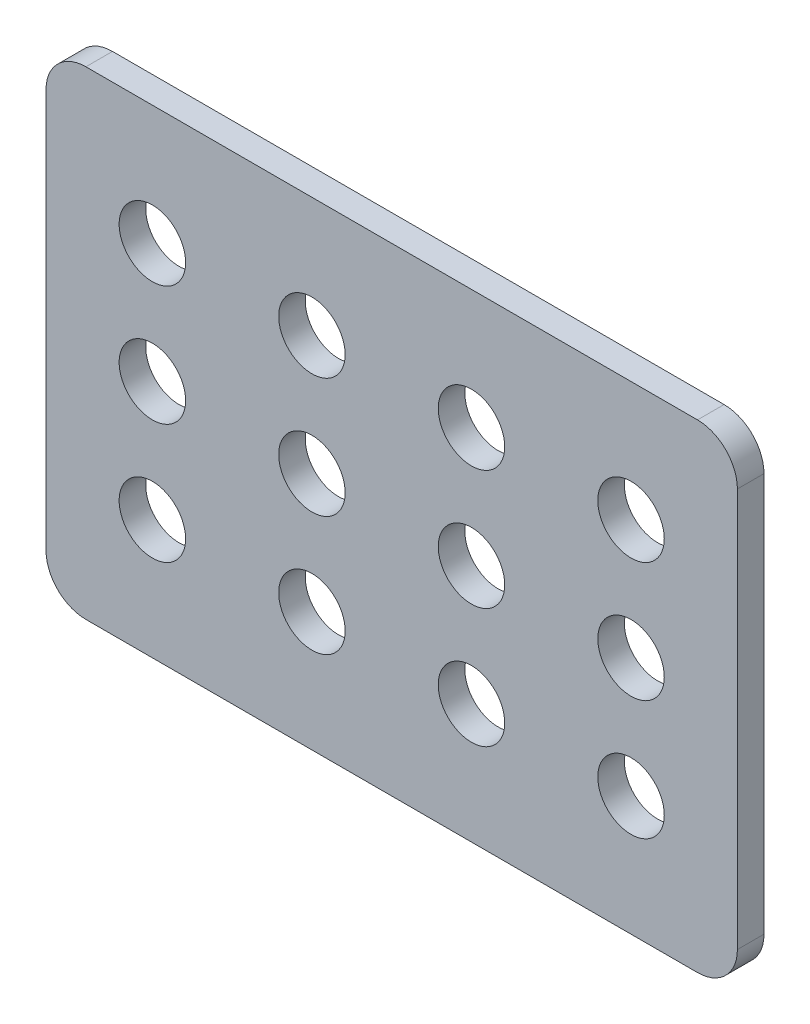
ISO-10303-21;
HEADER;
FILE_DESCRIPTION(('STEP AP214'),'2;1');
FILE_NAME('part.step','',(''),(''),'','','');
FILE_SCHEMA(('AUTOMOTIVE_DESIGN { 1 0 10303 214 1 1 1 1 }'));
ENDSEC;
DATA;
#1=APPLICATION_CONTEXT('core data for automotive mechanical design processes');
#2=APPLICATION_PROTOCOL_DEFINITION('international standard','automotive_design',2000,#1);
#3=PRODUCT_CONTEXT('',#1,'mechanical');
#4=PRODUCT('Part','Part','',(#3));
#5=PRODUCT_RELATED_PRODUCT_CATEGORY('part','',(#4));
#6=PRODUCT_DEFINITION_FORMATION('','',#4);
#7=PRODUCT_DEFINITION_CONTEXT('part definition',#1,'design');
#8=PRODUCT_DEFINITION('design','',#6,#7);
#9=PRODUCT_DEFINITION_SHAPE('','',#8);
#10=(LENGTH_UNIT() NAMED_UNIT(*) SI_UNIT(.MILLI.,.METRE.));
#11=(NAMED_UNIT(*) PLANE_ANGLE_UNIT() SI_UNIT($,.RADIAN.));
#12=(NAMED_UNIT(*) SI_UNIT($,.STERADIAN.) SOLID_ANGLE_UNIT());
#13=UNCERTAINTY_MEASURE_WITH_UNIT(LENGTH_MEASURE(1.E-05),#10,'distance_accuracy_value','');
#14=(GEOMETRIC_REPRESENTATION_CONTEXT(3) GLOBAL_UNCERTAINTY_ASSIGNED_CONTEXT((#13)) GLOBAL_UNIT_ASSIGNED_CONTEXT((#10,
#11,#12)) REPRESENTATION_CONTEXT('',''));
#15=CARTESIAN_POINT('',(0.,0.,0.));
#16=DIRECTION('',(0.,0.,1.));
#17=DIRECTION('',(1.,0.,0.));
#18=AXIS2_PLACEMENT_3D('',#15,#16,#17);
#19=CARTESIAN_POINT('',(245.,15.,10.));
#20=DIRECTION('',(0.,0.,1.));
#21=DIRECTION('',(1.,0.,0.));
#22=AXIS2_PLACEMENT_3D('',#19,#20,#21);
#23=PLANE('',#22);
#24=CARTESIAN_POINT('',(40.,90.,10.));
#25=DIRECTION('',(0.,0.,1.));
#26=DIRECTION('',(1.,0.,0.));
#27=AXIS2_PLACEMENT_3D('',#24,#25,#26);
#28=CIRCLE('',#27,12.4999999999998);
#29=CARTESIAN_POINT('',(52.4999999999998,90.,10.));
#30=VERTEX_POINT('',#29);
#31=EDGE_CURVE('E289',#30,#30,#28,.T.);
#32=ORIENTED_EDGE('',*,*,#31,.F.);
#33=EDGE_LOOP('',(#32));
#34=FACE_BOUND('',#33,.T.);
#35=CARTESIAN_POINT('',(160.,135.,10.));
#36=DIRECTION('',(0.,0.,1.));
#37=DIRECTION('',(1.,0.,0.));
#38=AXIS2_PLACEMENT_3D('',#35,#36,#37);
#39=CIRCLE('',#38,12.5);
#40=CARTESIAN_POINT('',(172.5,135.,10.));
#41=VERTEX_POINT('',#40);
#42=EDGE_CURVE('E273',#41,#41,#39,.T.);
#43=ORIENTED_EDGE('',*,*,#42,.F.);
#44=EDGE_LOOP('',(#43));
#45=FACE_BOUND('',#44,.T.);
#46=CARTESIAN_POINT('',(220.,90.,10.));
#47=DIRECTION('',(0.,0.,1.));
#48=DIRECTION('',(1.,0.,0.));
#49=AXIS2_PLACEMENT_3D('',#46,#47,#48);
#50=CIRCLE('',#49,12.4999999999999);
#51=CARTESIAN_POINT('',(232.5,90.,10.));
#52=VERTEX_POINT('',#51);
#53=EDGE_CURVE('E257',#52,#52,#50,.T.);
#54=ORIENTED_EDGE('',*,*,#53,.F.);
#55=EDGE_LOOP('',(#54));
#56=FACE_BOUND('',#55,.T.);
#57=CARTESIAN_POINT('',(100.,90.,10.));
#58=DIRECTION('',(0.,0.,1.));
#59=DIRECTION('',(1.,0.,0.));
#60=AXIS2_PLACEMENT_3D('',#57,#58,#59);
#61=CIRCLE('',#60,12.5);
#62=CARTESIAN_POINT('',(112.5,90.,10.));
#63=VERTEX_POINT('',#62);
#64=EDGE_CURVE('E241',#63,#63,#61,.T.);
#65=ORIENTED_EDGE('',*,*,#64,.F.);
#66=EDGE_LOOP('',(#65));
#67=FACE_BOUND('',#66,.T.);
#68=CARTESIAN_POINT('',(160.,45.,10.));
#69=DIRECTION('',(0.,0.,1.));
#70=DIRECTION('',(1.,0.,0.));
#71=AXIS2_PLACEMENT_3D('',#68,#69,#70);
#72=CIRCLE('',#71,12.5);
#73=CARTESIAN_POINT('',(172.5,45.,10.));
#74=VERTEX_POINT('',#73);
#75=EDGE_CURVE('E225',#74,#74,#72,.T.);
#76=ORIENTED_EDGE('',*,*,#75,.F.);
#77=EDGE_LOOP('',(#76));
#78=FACE_BOUND('',#77,.T.);
#79=CARTESIAN_POINT('',(40.,45.,10.));
#80=DIRECTION('',(0.,0.,1.));
#81=DIRECTION('',(1.,0.,0.));
#82=AXIS2_PLACEMENT_3D('',#79,#80,#81);
#83=CIRCLE('',#82,12.5);
#84=CARTESIAN_POINT('',(52.5,45.,10.));
#85=VERTEX_POINT('',#84);
#86=EDGE_CURVE('E150',#85,#85,#83,.T.);
#87=ORIENTED_EDGE('',*,*,#86,.F.);
#88=EDGE_LOOP('',(#87));
#89=FACE_BOUND('',#88,.T.);
#90=CARTESIAN_POINT('',(245.,15.,10.));
#91=DIRECTION('',(0.,0.,1.));
#92=DIRECTION('',(1.,0.,0.));
#93=AXIS2_PLACEMENT_3D('',#90,#91,#92);
#94=CIRCLE('',#93,15.);
#95=CARTESIAN_POINT('',(245.,0.,10.));
#96=VERTEX_POINT('',#95);
#97=CARTESIAN_POINT('',(260.,15.0000000000001,10.));
#98=VERTEX_POINT('',#97);
#99=EDGE_CURVE('E168',#96,#98,#94,.T.);
#100=ORIENTED_EDGE('',*,*,#99,.T.);
#101=DIRECTION('',(0.,1.,0.));
#102=VECTOR('',#101,1.);
#103=CARTESIAN_POINT('',(260.,15.0000000000001,10.));
#104=LINE('',#103,#102);
#105=CARTESIAN_POINT('',(260.,165.,10.));
#106=VERTEX_POINT('',#105);
#107=EDGE_CURVE('E104',#98,#106,#104,.T.);
#108=ORIENTED_EDGE('',*,*,#107,.T.);
#109=CARTESIAN_POINT('',(245.,165.,10.));
#110=DIRECTION('',(0.,0.,1.));
#111=DIRECTION('',(1.,0.,0.));
#112=AXIS2_PLACEMENT_3D('',#109,#110,#111);
#113=CIRCLE('',#112,15.);
#114=CARTESIAN_POINT('',(245.,180.,10.));
#115=VERTEX_POINT('',#114);
#116=EDGE_CURVE('E189',#106,#115,#113,.T.);
#117=ORIENTED_EDGE('',*,*,#116,.T.);
#118=DIRECTION('',(-1.,0.,0.));
#119=VECTOR('',#118,1.);
#120=CARTESIAN_POINT('',(15.0000000000001,180.,10.));
#121=LINE('',#120,#119);
#122=CARTESIAN_POINT('',(15.0000000000001,180.,10.));
#123=VERTEX_POINT('',#122);
#124=EDGE_CURVE('E203',#115,#123,#121,.T.);
#125=ORIENTED_EDGE('',*,*,#124,.T.);
#126=CARTESIAN_POINT('',(15.,165.,10.));
#127=DIRECTION('',(0.,0.,1.));
#128=DIRECTION('',(1.,0.,0.));
#129=AXIS2_PLACEMENT_3D('',#126,#127,#128);
#130=CIRCLE('',#129,15.);
#131=CARTESIAN_POINT('',(0.,165.,10.));
#132=VERTEX_POINT('',#131);
#133=EDGE_CURVE('E123',#123,#132,#130,.T.);
#134=ORIENTED_EDGE('',*,*,#133,.T.);
#135=DIRECTION('',(0.,-1.,0.));
#136=VECTOR('',#135,1.);
#137=CARTESIAN_POINT('',(0.,15.0000000000001,10.));
#138=LINE('',#137,#136);
#139=CARTESIAN_POINT('',(0.,15.,10.));
#140=VERTEX_POINT('',#139);
#141=EDGE_CURVE('E117',#132,#140,#138,.T.);
#142=ORIENTED_EDGE('',*,*,#141,.T.);
#143=CARTESIAN_POINT('',(15.,15.,10.));
#144=DIRECTION('',(0.,0.,1.));
#145=DIRECTION('',(-1.,0.,0.));
#146=AXIS2_PLACEMENT_3D('',#143,#144,#145);
#147=CIRCLE('',#146,15.);
#148=CARTESIAN_POINT('',(15.0000000000001,0.,10.));
#149=VERTEX_POINT('',#148);
#150=EDGE_CURVE('E121',#140,#149,#147,.T.);
#151=ORIENTED_EDGE('',*,*,#150,.T.);
#152=DIRECTION('',(1.,0.,0.));
#153=VECTOR('',#152,1.);
#154=CARTESIAN_POINT('',(15.0000000000001,0.,10.));
#155=LINE('',#154,#153);
#156=EDGE_CURVE('E61',#149,#96,#155,.T.);
#157=ORIENTED_EDGE('',*,*,#156,.T.);
#158=EDGE_LOOP('',(#100,#108,#117,#125,#134,#142,#151,#157));
#159=FACE_BOUND('',#158,.T.);
#160=CARTESIAN_POINT('',(100.,45.,10.));
#161=DIRECTION('',(0.,0.,1.));
#162=DIRECTION('',(1.,0.,0.));
#163=AXIS2_PLACEMENT_3D('',#160,#161,#162);
#164=CIRCLE('',#163,12.5);
#165=CARTESIAN_POINT('',(112.5,45.,10.));
#166=VERTEX_POINT('',#165);
#167=EDGE_CURVE('E217',#166,#166,#164,.T.);
#168=ORIENTED_EDGE('',*,*,#167,.F.);
#169=EDGE_LOOP('',(#168));
#170=FACE_BOUND('',#169,.T.);
#171=CARTESIAN_POINT('',(220.,45.,10.));
#172=DIRECTION('',(0.,0.,1.));
#173=DIRECTION('',(1.,0.,0.));
#174=AXIS2_PLACEMENT_3D('',#171,#172,#173);
#175=CIRCLE('',#174,12.5);
#176=CARTESIAN_POINT('',(232.5,45.,10.));
#177=VERTEX_POINT('',#176);
#178=EDGE_CURVE('E233',#177,#177,#175,.T.);
#179=ORIENTED_EDGE('',*,*,#178,.F.);
#180=EDGE_LOOP('',(#179));
#181=FACE_BOUND('',#180,.T.);
#182=CARTESIAN_POINT('',(160.,90.,10.));
#183=DIRECTION('',(0.,0.,1.));
#184=DIRECTION('',(1.,0.,0.));
#185=AXIS2_PLACEMENT_3D('',#182,#183,#184);
#186=CIRCLE('',#185,12.5);
#187=CARTESIAN_POINT('',(172.5,90.,10.));
#188=VERTEX_POINT('',#187);
#189=EDGE_CURVE('E249',#188,#188,#186,.T.);
#190=ORIENTED_EDGE('',*,*,#189,.F.);
#191=EDGE_LOOP('',(#190));
#192=FACE_BOUND('',#191,.T.);
#193=CARTESIAN_POINT('',(100.,135.,10.));
#194=DIRECTION('',(0.,0.,1.));
#195=DIRECTION('',(1.,0.,0.));
#196=AXIS2_PLACEMENT_3D('',#193,#194,#195);
#197=CIRCLE('',#196,12.5);
#198=CARTESIAN_POINT('',(112.5,135.,10.));
#199=VERTEX_POINT('',#198);
#200=EDGE_CURVE('E265',#199,#199,#197,.T.);
#201=ORIENTED_EDGE('',*,*,#200,.F.);
#202=EDGE_LOOP('',(#201));
#203=FACE_BOUND('',#202,.T.);
#204=CARTESIAN_POINT('',(220.,135.,10.));
#205=DIRECTION('',(0.,0.,1.));
#206=DIRECTION('',(1.,0.,0.));
#207=AXIS2_PLACEMENT_3D('',#204,#205,#206);
#208=CIRCLE('',#207,12.4999999999999);
#209=CARTESIAN_POINT('',(232.5,135.,10.));
#210=VERTEX_POINT('',#209);
#211=EDGE_CURVE('E281',#210,#210,#208,.T.);
#212=ORIENTED_EDGE('',*,*,#211,.F.);
#213=EDGE_LOOP('',(#212));
#214=FACE_BOUND('',#213,.T.);
#215=CARTESIAN_POINT('',(40.,135.,10.));
#216=DIRECTION('',(0.,0.,1.));
#217=DIRECTION('',(1.,0.,0.));
#218=AXIS2_PLACEMENT_3D('',#215,#216,#217);
#219=CIRCLE('',#218,12.5);
#220=CARTESIAN_POINT('',(52.5,135.,10.));
#221=VERTEX_POINT('',#220);
#222=EDGE_CURVE('E297',#221,#221,#219,.T.);
#223=ORIENTED_EDGE('',*,*,#222,.F.);
#224=EDGE_LOOP('',(#223));
#225=FACE_BOUND('',#224,.T.);
#226=ADVANCED_FACE('F43',(#34,#45,#56,#67,#78,#89,#159,#170,#181,#192,#203,#214,#225),#23,.T.);
#227=CARTESIAN_POINT('',(245.,15.,0.));
#228=DIRECTION('',(0.,0.,1.));
#229=DIRECTION('',(1.,0.,0.));
#230=AXIS2_PLACEMENT_3D('',#227,#228,#229);
#231=PLANE('',#230);
#232=CARTESIAN_POINT('',(245.,15.,0.));
#233=DIRECTION('',(0.,0.,1.));
#234=DIRECTION('',(1.,0.,0.));
#235=AXIS2_PLACEMENT_3D('',#232,#233,#234);
#236=CIRCLE('',#235,15.);
#237=CARTESIAN_POINT('',(245.,0.,0.));
#238=VERTEX_POINT('',#237);
#239=CARTESIAN_POINT('',(260.,15.0000000000001,0.));
#240=VERTEX_POINT('',#239);
#241=EDGE_CURVE('E145',#238,#240,#236,.T.);
#242=ORIENTED_EDGE('',*,*,#241,.F.);
#243=DIRECTION('',(1.,0.,0.));
#244=VECTOR('',#243,1.);
#245=CARTESIAN_POINT('',(15.0000000000001,0.,0.));
#246=LINE('',#245,#244);
#247=CARTESIAN_POINT('',(15.0000000000001,0.,0.));
#248=VERTEX_POINT('',#247);
#249=EDGE_CURVE('E96',#248,#238,#246,.T.);
#250=ORIENTED_EDGE('',*,*,#249,.F.);
#251=CARTESIAN_POINT('',(15.,15.,0.));
#252=DIRECTION('',(0.,0.,1.));
#253=DIRECTION('',(-1.,0.,0.));
#254=AXIS2_PLACEMENT_3D('',#251,#252,#253);
#255=CIRCLE('',#254,15.);
#256=CARTESIAN_POINT('',(0.,15.,0.));
#257=VERTEX_POINT('',#256);
#258=EDGE_CURVE('E90',#257,#248,#255,.T.);
#259=ORIENTED_EDGE('',*,*,#258,.F.);
#260=DIRECTION('',(0.,-1.,0.));
#261=VECTOR('',#260,1.);
#262=CARTESIAN_POINT('',(0.,15.0000000000001,0.));
#263=LINE('',#262,#261);
#264=CARTESIAN_POINT('',(0.,165.,0.));
#265=VERTEX_POINT('',#264);
#266=EDGE_CURVE('E132',#265,#257,#263,.T.);
#267=ORIENTED_EDGE('',*,*,#266,.F.);
#268=CARTESIAN_POINT('',(15.,165.,0.));
#269=DIRECTION('',(0.,0.,1.));
#270=DIRECTION('',(1.,0.,0.));
#271=AXIS2_PLACEMENT_3D('',#268,#269,#270);
#272=CIRCLE('',#271,15.);
#273=CARTESIAN_POINT('',(15.0000000000001,180.,0.));
#274=VERTEX_POINT('',#273);
#275=EDGE_CURVE('E159',#274,#265,#272,.T.);
#276=ORIENTED_EDGE('',*,*,#275,.F.);
#277=DIRECTION('',(-1.,0.,0.));
#278=VECTOR('',#277,1.);
#279=CARTESIAN_POINT('',(15.0000000000001,180.,0.));
#280=LINE('',#279,#278);
#281=CARTESIAN_POINT('',(245.,180.,0.));
#282=VERTEX_POINT('',#281);
#283=EDGE_CURVE('E156',#282,#274,#280,.T.);
#284=ORIENTED_EDGE('',*,*,#283,.F.);
#285=CARTESIAN_POINT('',(245.,165.,0.));
#286=DIRECTION('',(0.,0.,1.));
#287=DIRECTION('',(1.,0.,0.));
#288=AXIS2_PLACEMENT_3D('',#285,#286,#287);
#289=CIRCLE('',#288,15.);
#290=CARTESIAN_POINT('',(260.,165.,0.));
#291=VERTEX_POINT('',#290);
#292=EDGE_CURVE('E153',#291,#282,#289,.T.);
#293=ORIENTED_EDGE('',*,*,#292,.F.);
#294=DIRECTION('',(0.,1.,0.));
#295=VECTOR('',#294,1.);
#296=CARTESIAN_POINT('',(260.,15.0000000000001,0.));
#297=LINE('',#296,#295);
#298=EDGE_CURVE('E149',#240,#291,#297,.T.);
#299=ORIENTED_EDGE('',*,*,#298,.F.);
#300=EDGE_LOOP('',(#242,#250,#259,#267,#276,#284,#293,#299));
#301=FACE_BOUND('',#300,.T.);
#302=CARTESIAN_POINT('',(40.,45.,0.));
#303=DIRECTION('',(0.,0.,1.));
#304=DIRECTION('',(1.,0.,0.));
#305=AXIS2_PLACEMENT_3D('',#302,#303,#304);
#306=CIRCLE('',#305,12.5);
#307=CARTESIAN_POINT('',(52.5,45.,0.));
#308=VERTEX_POINT('',#307);
#309=EDGE_CURVE('E213',#308,#308,#306,.T.);
#310=ORIENTED_EDGE('',*,*,#309,.T.);
#311=EDGE_LOOP('',(#310));
#312=FACE_BOUND('',#311,.T.);
#313=CARTESIAN_POINT('',(100.,45.,0.));
#314=DIRECTION('',(0.,0.,1.));
#315=DIRECTION('',(1.,0.,0.));
#316=AXIS2_PLACEMENT_3D('',#313,#314,#315);
#317=CIRCLE('',#316,12.5);
#318=CARTESIAN_POINT('',(112.5,45.,0.));
#319=VERTEX_POINT('',#318);
#320=EDGE_CURVE('E221',#319,#319,#317,.T.);
#321=ORIENTED_EDGE('',*,*,#320,.T.);
#322=EDGE_LOOP('',(#321));
#323=FACE_BOUND('',#322,.T.);
#324=CARTESIAN_POINT('',(160.,45.,0.));
#325=DIRECTION('',(0.,0.,1.));
#326=DIRECTION('',(1.,0.,0.));
#327=AXIS2_PLACEMENT_3D('',#324,#325,#326);
#328=CIRCLE('',#327,12.5);
#329=CARTESIAN_POINT('',(172.5,45.,0.));
#330=VERTEX_POINT('',#329);
#331=EDGE_CURVE('E229',#330,#330,#328,.T.);
#332=ORIENTED_EDGE('',*,*,#331,.T.);
#333=EDGE_LOOP('',(#332));
#334=FACE_BOUND('',#333,.T.);
#335=CARTESIAN_POINT('',(220.,45.,0.));
#336=DIRECTION('',(0.,0.,1.));
#337=DIRECTION('',(1.,0.,0.));
#338=AXIS2_PLACEMENT_3D('',#335,#336,#337);
#339=CIRCLE('',#338,12.5);
#340=CARTESIAN_POINT('',(232.5,45.,0.));
#341=VERTEX_POINT('',#340);
#342=EDGE_CURVE('E237',#341,#341,#339,.T.);
#343=ORIENTED_EDGE('',*,*,#342,.T.);
#344=EDGE_LOOP('',(#343));
#345=FACE_BOUND('',#344,.T.);
#346=CARTESIAN_POINT('',(100.,90.,0.));
#347=DIRECTION('',(0.,0.,1.));
#348=DIRECTION('',(1.,0.,0.));
#349=AXIS2_PLACEMENT_3D('',#346,#347,#348);
#350=CIRCLE('',#349,12.5);
#351=CARTESIAN_POINT('',(112.5,90.,0.));
#352=VERTEX_POINT('',#351);
#353=EDGE_CURVE('E245',#352,#352,#350,.T.);
#354=ORIENTED_EDGE('',*,*,#353,.T.);
#355=EDGE_LOOP('',(#354));
#356=FACE_BOUND('',#355,.T.);
#357=CARTESIAN_POINT('',(160.,90.,0.));
#358=DIRECTION('',(0.,0.,1.));
#359=DIRECTION('',(1.,0.,0.));
#360=AXIS2_PLACEMENT_3D('',#357,#358,#359);
#361=CIRCLE('',#360,12.5);
#362=CARTESIAN_POINT('',(172.5,90.,0.));
#363=VERTEX_POINT('',#362);
#364=EDGE_CURVE('E253',#363,#363,#361,.T.);
#365=ORIENTED_EDGE('',*,*,#364,.T.);
#366=EDGE_LOOP('',(#365));
#367=FACE_BOUND('',#366,.T.);
#368=CARTESIAN_POINT('',(220.,90.,0.));
#369=DIRECTION('',(0.,0.,1.));
#370=DIRECTION('',(1.,0.,0.));
#371=AXIS2_PLACEMENT_3D('',#368,#369,#370);
#372=CIRCLE('',#371,12.4999999999999);
#373=CARTESIAN_POINT('',(232.5,90.,0.));
#374=VERTEX_POINT('',#373);
#375=EDGE_CURVE('E261',#374,#374,#372,.T.);
#376=ORIENTED_EDGE('',*,*,#375,.T.);
#377=EDGE_LOOP('',(#376));
#378=FACE_BOUND('',#377,.T.);
#379=CARTESIAN_POINT('',(100.,135.,0.));
#380=DIRECTION('',(0.,0.,1.));
#381=DIRECTION('',(1.,0.,0.));
#382=AXIS2_PLACEMENT_3D('',#379,#380,#381);
#383=CIRCLE('',#382,12.5);
#384=CARTESIAN_POINT('',(112.5,135.,0.));
#385=VERTEX_POINT('',#384);
#386=EDGE_CURVE('E269',#385,#385,#383,.T.);
#387=ORIENTED_EDGE('',*,*,#386,.T.);
#388=EDGE_LOOP('',(#387));
#389=FACE_BOUND('',#388,.T.);
#390=CARTESIAN_POINT('',(160.,135.,0.));
#391=DIRECTION('',(0.,0.,1.));
#392=DIRECTION('',(1.,0.,0.));
#393=AXIS2_PLACEMENT_3D('',#390,#391,#392);
#394=CIRCLE('',#393,12.5);
#395=CARTESIAN_POINT('',(172.5,135.,0.));
#396=VERTEX_POINT('',#395);
#397=EDGE_CURVE('E277',#396,#396,#394,.T.);
#398=ORIENTED_EDGE('',*,*,#397,.T.);
#399=EDGE_LOOP('',(#398));
#400=FACE_BOUND('',#399,.T.);
#401=CARTESIAN_POINT('',(220.,135.,0.));
#402=DIRECTION('',(0.,0.,1.));
#403=DIRECTION('',(1.,0.,0.));
#404=AXIS2_PLACEMENT_3D('',#401,#402,#403);
#405=CIRCLE('',#404,12.4999999999999);
#406=CARTESIAN_POINT('',(232.5,135.,0.));
#407=VERTEX_POINT('',#406);
#408=EDGE_CURVE('E285',#407,#407,#405,.T.);
#409=ORIENTED_EDGE('',*,*,#408,.T.);
#410=EDGE_LOOP('',(#409));
#411=FACE_BOUND('',#410,.T.);
#412=CARTESIAN_POINT('',(40.,90.,0.));
#413=DIRECTION('',(0.,0.,1.));
#414=DIRECTION('',(1.,0.,0.));
#415=AXIS2_PLACEMENT_3D('',#412,#413,#414);
#416=CIRCLE('',#415,12.4999999999998);
#417=CARTESIAN_POINT('',(52.4999999999998,90.,0.));
#418=VERTEX_POINT('',#417);
#419=EDGE_CURVE('E293',#418,#418,#416,.T.);
#420=ORIENTED_EDGE('',*,*,#419,.T.);
#421=EDGE_LOOP('',(#420));
#422=FACE_BOUND('',#421,.T.);
#423=CARTESIAN_POINT('',(40.,135.,0.));
#424=DIRECTION('',(0.,0.,1.));
#425=DIRECTION('',(1.,0.,0.));
#426=AXIS2_PLACEMENT_3D('',#423,#424,#425);
#427=CIRCLE('',#426,12.5);
#428=CARTESIAN_POINT('',(52.5,135.,0.));
#429=VERTEX_POINT('',#428);
#430=EDGE_CURVE('E301',#429,#429,#427,.T.);
#431=ORIENTED_EDGE('',*,*,#430,.T.);
#432=EDGE_LOOP('',(#431));
#433=FACE_BOUND('',#432,.T.);
#434=ADVANCED_FACE('F193',(#301,#312,#323,#334,#345,#356,#367,#378,#389,#400,#411,#422,#433),
#231,.F.);
#435=CARTESIAN_POINT('',(245.,15.,10.));
#436=DIRECTION('',(0.,0.,-1.));
#437=DIRECTION('',(-1.,0.,0.));
#438=AXIS2_PLACEMENT_3D('',#435,#436,#437);
#439=CYLINDRICAL_SURFACE('',#438,15.);
#440=ORIENTED_EDGE('',*,*,#241,.T.);
#441=DIRECTION('',(0.,0.,-1.));
#442=VECTOR('',#441,1.);
#443=CARTESIAN_POINT('',(260.,15.0000000000001,10.));
#444=LINE('',#443,#442);
#445=EDGE_CURVE('E11',#98,#240,#444,.T.);
#446=ORIENTED_EDGE('',*,*,#445,.F.);
#447=ORIENTED_EDGE('',*,*,#99,.F.);
#448=DIRECTION('',(0.,0.,-1.));
#449=VECTOR('',#448,1.);
#450=CARTESIAN_POINT('',(245.,0.,10.));
#451=LINE('',#450,#449);
#452=EDGE_CURVE('E141',#96,#238,#451,.T.);
#453=ORIENTED_EDGE('',*,*,#452,.T.);
#454=EDGE_LOOP('',(#440,#446,#447,#453));
#455=FACE_BOUND('',#454,.T.);
#456=ADVANCED_FACE('F45',(#455),#439,.T.);
#457=CARTESIAN_POINT('',(260.,15.0000000000001,10.));
#458=DIRECTION('',(-1.,0.,0.));
#459=DIRECTION('',(0.,0.,1.));
#460=AXIS2_PLACEMENT_3D('',#457,#458,#459);
#461=PLANE('',#460);
#462=ORIENTED_EDGE('',*,*,#298,.T.);
#463=DIRECTION('',(0.,0.,-1.));
#464=VECTOR('',#463,1.);
#465=CARTESIAN_POINT('',(260.,165.,10.));
#466=LINE('',#465,#464);
#467=EDGE_CURVE('E53',#106,#291,#466,.T.);
#468=ORIENTED_EDGE('',*,*,#467,.F.);
#469=ORIENTED_EDGE('',*,*,#107,.F.);
#470=ORIENTED_EDGE('',*,*,#445,.T.);
#471=EDGE_LOOP('',(#462,#468,#469,#470));
#472=FACE_BOUND('',#471,.T.);
#473=ADVANCED_FACE('F337',(#472),#461,.F.);
#474=CARTESIAN_POINT('',(245.,165.,10.));
#475=DIRECTION('',(0.,0.,-1.));
#476=DIRECTION('',(-1.,0.,0.));
#477=AXIS2_PLACEMENT_3D('',#474,#475,#476);
#478=CYLINDRICAL_SURFACE('',#477,15.);
#479=ORIENTED_EDGE('',*,*,#292,.T.);
#480=DIRECTION('',(0.,0.,-1.));
#481=VECTOR('',#480,1.);
#482=CARTESIAN_POINT('',(245.,180.,10.));
#483=LINE('',#482,#481);
#484=EDGE_CURVE('E179',#115,#282,#483,.T.);
#485=ORIENTED_EDGE('',*,*,#484,.F.);
#486=ORIENTED_EDGE('',*,*,#116,.F.);
#487=ORIENTED_EDGE('',*,*,#467,.T.);
#488=EDGE_LOOP('',(#479,#485,#486,#487));
#489=FACE_BOUND('',#488,.T.);
#490=ADVANCED_FACE('F187',(#489),#478,.T.);
#491=CARTESIAN_POINT('',(15.0000000000001,180.,10.));
#492=DIRECTION('',(0.,-1.,0.));
#493=DIRECTION('',(0.,0.,-1.));
#494=AXIS2_PLACEMENT_3D('',#491,#492,#493);
#495=PLANE('',#494);
#496=ORIENTED_EDGE('',*,*,#283,.T.);
#497=DIRECTION('',(0.,0.,-1.));
#498=VECTOR('',#497,1.);
#499=CARTESIAN_POINT('',(15.0000000000001,180.,10.));
#500=LINE('',#499,#498);
#501=EDGE_CURVE('E175',#123,#274,#500,.T.);
#502=ORIENTED_EDGE('',*,*,#501,.F.);
#503=ORIENTED_EDGE('',*,*,#124,.F.);
#504=ORIENTED_EDGE('',*,*,#484,.T.);
#505=EDGE_LOOP('',(#496,#502,#503,#504));
#506=FACE_BOUND('',#505,.T.);
#507=ADVANCED_FACE('F198',(#506),#495,.F.);
#508=CARTESIAN_POINT('',(15.,165.,10.));
#509=DIRECTION('',(0.,0.,-1.));
#510=DIRECTION('',(-1.,0.,0.));
#511=AXIS2_PLACEMENT_3D('',#508,#509,#510);
#512=CYLINDRICAL_SURFACE('',#511,15.);
#513=ORIENTED_EDGE('',*,*,#275,.T.);
#514=DIRECTION('',(0.,0.,-1.));
#515=VECTOR('',#514,1.);
#516=CARTESIAN_POINT('',(0.,165.,10.));
#517=LINE('',#516,#515);
#518=EDGE_CURVE('E134',#132,#265,#517,.T.);
#519=ORIENTED_EDGE('',*,*,#518,.F.);
#520=ORIENTED_EDGE('',*,*,#133,.F.);
#521=ORIENTED_EDGE('',*,*,#501,.T.);
#522=EDGE_LOOP('',(#513,#519,#520,#521));
#523=FACE_BOUND('',#522,.T.);
#524=ADVANCED_FACE('F201',(#523),#512,.T.);
#525=CARTESIAN_POINT('',(0.,15.0000000000001,10.));
#526=DIRECTION('',(1.,0.,0.));
#527=DIRECTION('',(0.,0.,-1.));
#528=AXIS2_PLACEMENT_3D('',#525,#526,#527);
#529=PLANE('',#528);
#530=ORIENTED_EDGE('',*,*,#266,.T.);
#531=DIRECTION('',(0.,0.,-1.));
#532=VECTOR('',#531,1.);
#533=CARTESIAN_POINT('',(0.,15.,10.));
#534=LINE('',#533,#532);
#535=EDGE_CURVE('E129',#140,#257,#534,.T.);
#536=ORIENTED_EDGE('',*,*,#535,.F.);
#537=ORIENTED_EDGE('',*,*,#141,.F.);
#538=ORIENTED_EDGE('',*,*,#518,.T.);
#539=EDGE_LOOP('',(#530,#536,#537,#538));
#540=FACE_BOUND('',#539,.T.);
#541=ADVANCED_FACE('F130',(#540),#529,.F.);
#542=CARTESIAN_POINT('',(15.,15.,10.));
#543=DIRECTION('',(0.,0.,-1.));
#544=DIRECTION('',(-1.,0.,0.));
#545=AXIS2_PLACEMENT_3D('',#542,#543,#544);
#546=CYLINDRICAL_SURFACE('',#545,15.);
#547=ORIENTED_EDGE('',*,*,#258,.T.);
#548=DIRECTION('',(0.,0.,-1.));
#549=VECTOR('',#548,1.);
#550=CARTESIAN_POINT('',(15.0000000000001,0.,10.));
#551=LINE('',#550,#549);
#552=EDGE_CURVE('E135',#149,#248,#551,.T.);
#553=ORIENTED_EDGE('',*,*,#552,.F.);
#554=ORIENTED_EDGE('',*,*,#150,.F.);
#555=ORIENTED_EDGE('',*,*,#535,.T.);
#556=EDGE_LOOP('',(#547,#553,#554,#555));
#557=FACE_BOUND('',#556,.T.);
#558=ADVANCED_FACE('F137',(#557),#546,.T.);
#559=CARTESIAN_POINT('',(15.0000000000001,0.,10.));
#560=DIRECTION('',(0.,1.,0.));
#561=DIRECTION('',(0.,0.,1.));
#562=AXIS2_PLACEMENT_3D('',#559,#560,#561);
#563=PLANE('',#562);
#564=ORIENTED_EDGE('',*,*,#249,.T.);
#565=ORIENTED_EDGE('',*,*,#452,.F.);
#566=ORIENTED_EDGE('',*,*,#156,.F.);
#567=ORIENTED_EDGE('',*,*,#552,.T.);
#568=EDGE_LOOP('',(#564,#565,#566,#567));
#569=FACE_BOUND('',#568,.T.);
#570=ADVANCED_FACE('F325',(#569),#563,.F.);
#571=CARTESIAN_POINT('',(40.,45.,10.));
#572=DIRECTION('',(0.,0.,-1.));
#573=DIRECTION('',(-1.,0.,0.));
#574=AXIS2_PLACEMENT_3D('',#571,#572,#573);
#575=CYLINDRICAL_SURFACE('',#574,12.5);
#576=ORIENTED_EDGE('',*,*,#86,.T.);
#577=EDGE_LOOP('',(#576));
#578=FACE_BOUND('',#577,.T.);
#579=ORIENTED_EDGE('',*,*,#309,.F.);
#580=EDGE_LOOP('',(#579));
#581=FACE_BOUND('',#580,.T.);
#582=ADVANCED_FACE('F322',(#578,#581),#575,.F.);
#583=CARTESIAN_POINT('',(100.,45.,10.));
#584=DIRECTION('',(0.,0.,-1.));
#585=DIRECTION('',(-1.,0.,0.));
#586=AXIS2_PLACEMENT_3D('',#583,#584,#585);
#587=CYLINDRICAL_SURFACE('',#586,12.5);
#588=ORIENTED_EDGE('',*,*,#167,.T.);
#589=EDGE_LOOP('',(#588));
#590=FACE_BOUND('',#589,.T.);
#591=ORIENTED_EDGE('',*,*,#320,.F.);
#592=EDGE_LOOP('',(#591));
#593=FACE_BOUND('',#592,.T.);
#594=ADVANCED_FACE('F413',(#590,#593),#587,.F.);
#595=CARTESIAN_POINT('',(160.,45.,10.));
#596=DIRECTION('',(0.,0.,-1.));
#597=DIRECTION('',(-1.,0.,0.));
#598=AXIS2_PLACEMENT_3D('',#595,#596,#597);
#599=CYLINDRICAL_SURFACE('',#598,12.5);
#600=ORIENTED_EDGE('',*,*,#75,.T.);
#601=EDGE_LOOP('',(#600));
#602=FACE_BOUND('',#601,.T.);
#603=ORIENTED_EDGE('',*,*,#331,.F.);
#604=EDGE_LOOP('',(#603));
#605=FACE_BOUND('',#604,.T.);
#606=ADVANCED_FACE('F422',(#602,#605),#599,.F.);
#607=CARTESIAN_POINT('',(220.,45.,10.));
#608=DIRECTION('',(0.,0.,-1.));
#609=DIRECTION('',(-1.,0.,0.));
#610=AXIS2_PLACEMENT_3D('',#607,#608,#609);
#611=CYLINDRICAL_SURFACE('',#610,12.5);
#612=ORIENTED_EDGE('',*,*,#178,.T.);
#613=EDGE_LOOP('',(#612));
#614=FACE_BOUND('',#613,.T.);
#615=ORIENTED_EDGE('',*,*,#342,.F.);
#616=EDGE_LOOP('',(#615));
#617=FACE_BOUND('',#616,.T.);
#618=ADVANCED_FACE('F431',(#614,#617),#611,.F.);
#619=CARTESIAN_POINT('',(100.,90.,10.));
#620=DIRECTION('',(0.,0.,-1.));
#621=DIRECTION('',(-1.,0.,0.));
#622=AXIS2_PLACEMENT_3D('',#619,#620,#621);
#623=CYLINDRICAL_SURFACE('',#622,12.5);
#624=ORIENTED_EDGE('',*,*,#64,.T.);
#625=EDGE_LOOP('',(#624));
#626=FACE_BOUND('',#625,.T.);
#627=ORIENTED_EDGE('',*,*,#353,.F.);
#628=EDGE_LOOP('',(#627));
#629=FACE_BOUND('',#628,.T.);
#630=ADVANCED_FACE('F441',(#626,#629),#623,.F.);
#631=CARTESIAN_POINT('',(160.,90.,10.));
#632=DIRECTION('',(0.,0.,-1.));
#633=DIRECTION('',(-1.,0.,0.));
#634=AXIS2_PLACEMENT_3D('',#631,#632,#633);
#635=CYLINDRICAL_SURFACE('',#634,12.5);
#636=ORIENTED_EDGE('',*,*,#189,.T.);
#637=EDGE_LOOP('',(#636));
#638=FACE_BOUND('',#637,.T.);
#639=ORIENTED_EDGE('',*,*,#364,.F.);
#640=EDGE_LOOP('',(#639));
#641=FACE_BOUND('',#640,.T.);
#642=ADVANCED_FACE('F451',(#638,#641),#635,.F.);
#643=CARTESIAN_POINT('',(220.,90.,10.));
#644=DIRECTION('',(0.,0.,-1.));
#645=DIRECTION('',(-1.,0.,0.));
#646=AXIS2_PLACEMENT_3D('',#643,#644,#645);
#647=CYLINDRICAL_SURFACE('',#646,12.4999999999999);
#648=ORIENTED_EDGE('',*,*,#53,.T.);
#649=EDGE_LOOP('',(#648));
#650=FACE_BOUND('',#649,.T.);
#651=ORIENTED_EDGE('',*,*,#375,.F.);
#652=EDGE_LOOP('',(#651));
#653=FACE_BOUND('',#652,.T.);
#654=ADVANCED_FACE('F461',(#650,#653),#647,.F.);
#655=CARTESIAN_POINT('',(100.,135.,10.));
#656=DIRECTION('',(0.,0.,-1.));
#657=DIRECTION('',(-1.,0.,0.));
#658=AXIS2_PLACEMENT_3D('',#655,#656,#657);
#659=CYLINDRICAL_SURFACE('',#658,12.5);
#660=ORIENTED_EDGE('',*,*,#200,.T.);
#661=EDGE_LOOP('',(#660));
#662=FACE_BOUND('',#661,.T.);
#663=ORIENTED_EDGE('',*,*,#386,.F.);
#664=EDGE_LOOP('',(#663));
#665=FACE_BOUND('',#664,.T.);
#666=ADVANCED_FACE('F471',(#662,#665),#659,.F.);
#667=CARTESIAN_POINT('',(160.,135.,10.));
#668=DIRECTION('',(0.,0.,-1.));
#669=DIRECTION('',(-1.,0.,0.));
#670=AXIS2_PLACEMENT_3D('',#667,#668,#669);
#671=CYLINDRICAL_SURFACE('',#670,12.5);
#672=ORIENTED_EDGE('',*,*,#42,.T.);
#673=EDGE_LOOP('',(#672));
#674=FACE_BOUND('',#673,.T.);
#675=ORIENTED_EDGE('',*,*,#397,.F.);
#676=EDGE_LOOP('',(#675));
#677=FACE_BOUND('',#676,.T.);
#678=ADVANCED_FACE('F481',(#674,#677),#671,.F.);
#679=CARTESIAN_POINT('',(220.,135.,10.));
#680=DIRECTION('',(0.,0.,-1.));
#681=DIRECTION('',(-1.,0.,0.));
#682=AXIS2_PLACEMENT_3D('',#679,#680,#681);
#683=CYLINDRICAL_SURFACE('',#682,12.4999999999999);
#684=ORIENTED_EDGE('',*,*,#211,.T.);
#685=EDGE_LOOP('',(#684));
#686=FACE_BOUND('',#685,.T.);
#687=ORIENTED_EDGE('',*,*,#408,.F.);
#688=EDGE_LOOP('',(#687));
#689=FACE_BOUND('',#688,.T.);
#690=ADVANCED_FACE('F491',(#686,#689),#683,.F.);
#691=CARTESIAN_POINT('',(40.,90.,10.));
#692=DIRECTION('',(0.,0.,-1.));
#693=DIRECTION('',(-1.,0.,0.));
#694=AXIS2_PLACEMENT_3D('',#691,#692,#693);
#695=CYLINDRICAL_SURFACE('',#694,12.4999999999998);
#696=ORIENTED_EDGE('',*,*,#31,.T.);
#697=EDGE_LOOP('',(#696));
#698=FACE_BOUND('',#697,.T.);
#699=ORIENTED_EDGE('',*,*,#419,.F.);
#700=EDGE_LOOP('',(#699));
#701=FACE_BOUND('',#700,.T.);
#702=ADVANCED_FACE('F501',(#698,#701),#695,.F.);
#703=CARTESIAN_POINT('',(40.,135.,10.));
#704=DIRECTION('',(0.,0.,-1.));
#705=DIRECTION('',(-1.,0.,0.));
#706=AXIS2_PLACEMENT_3D('',#703,#704,#705);
#707=CYLINDRICAL_SURFACE('',#706,12.5);
#708=ORIENTED_EDGE('',*,*,#222,.T.);
#709=EDGE_LOOP('',(#708));
#710=FACE_BOUND('',#709,.T.);
#711=ORIENTED_EDGE('',*,*,#430,.F.);
#712=EDGE_LOOP('',(#711));
#713=FACE_BOUND('',#712,.T.);
#714=ADVANCED_FACE('F309',(#710,#713),#707,.F.);
#715=CLOSED_SHELL('',(#226,#434,#456,#473,#490,#507,#524,#541,#558,#570,#582,#594,#606,#618,
#630,#642,#654,#666,#678,#690,#702,#714));
#716=MANIFOLD_SOLID_BREP('B2',#715);
#717=ADVANCED_BREP_SHAPE_REPRESENTATION('',(#18,#716),#14);
#718=SHAPE_DEFINITION_REPRESENTATION(#9,#717);
ENDSEC;
END-ISO-10303-21;
